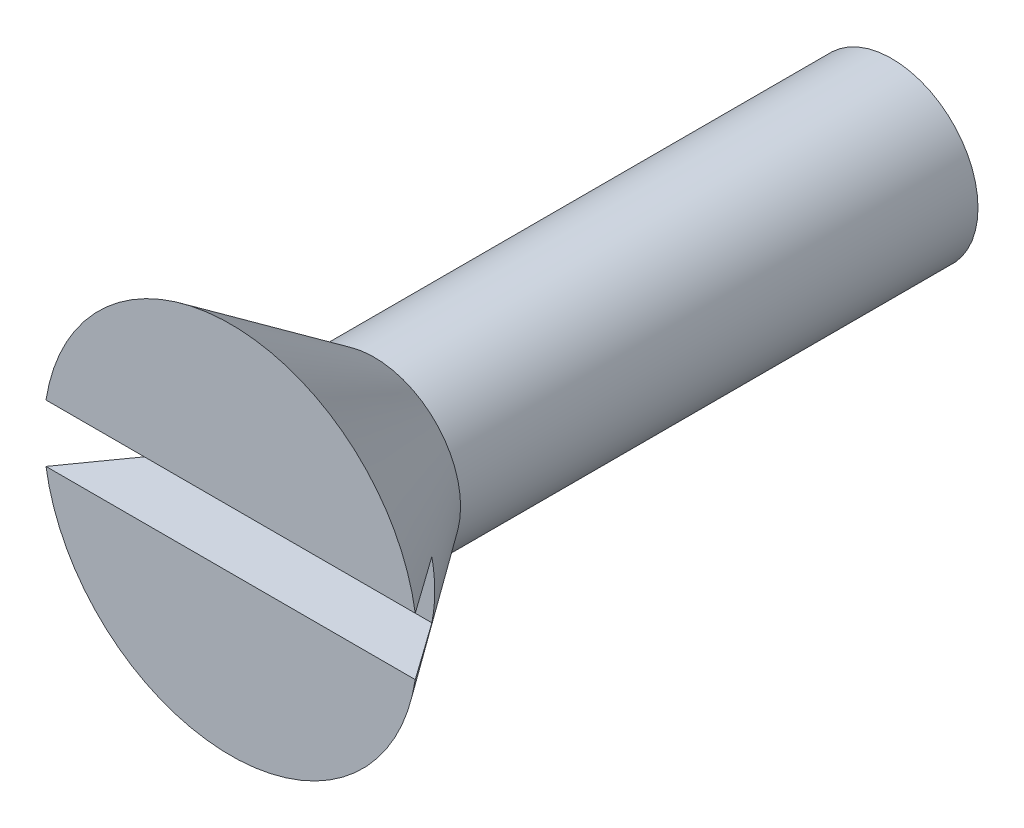
ISO-10303-21;
HEADER;
FILE_DESCRIPTION(('STEP AP214'),'2;1');
FILE_NAME('part.step','',(''),(''),'','','');
FILE_SCHEMA(('AUTOMOTIVE_DESIGN { 1 0 10303 214 1 1 1 1 }'));
ENDSEC;
DATA;
#1=APPLICATION_CONTEXT('core data for automotive mechanical design processes');
#2=APPLICATION_PROTOCOL_DEFINITION('international standard','automotive_design',2000,#1);
#3=PRODUCT_CONTEXT('',#1,'mechanical');
#4=PRODUCT('Part','Part','',(#3));
#5=PRODUCT_RELATED_PRODUCT_CATEGORY('part','',(#4));
#6=PRODUCT_DEFINITION_FORMATION('','',#4);
#7=PRODUCT_DEFINITION_CONTEXT('part definition',#1,'design');
#8=PRODUCT_DEFINITION('design','',#6,#7);
#9=PRODUCT_DEFINITION_SHAPE('','',#8);
#10=(LENGTH_UNIT() NAMED_UNIT(*) SI_UNIT(.MILLI.,.METRE.));
#11=(NAMED_UNIT(*) PLANE_ANGLE_UNIT() SI_UNIT($,.RADIAN.));
#12=(NAMED_UNIT(*) SI_UNIT($,.STERADIAN.) SOLID_ANGLE_UNIT());
#13=UNCERTAINTY_MEASURE_WITH_UNIT(LENGTH_MEASURE(1.E-05),#10,'distance_accuracy_value','');
#14=(GEOMETRIC_REPRESENTATION_CONTEXT(3) GLOBAL_UNCERTAINTY_ASSIGNED_CONTEXT((#13)) GLOBAL_UNIT_ASSIGNED_CONTEXT((#10,
#11,#12)) REPRESENTATION_CONTEXT('',''));
#15=CARTESIAN_POINT('',(0.,0.,0.));
#16=DIRECTION('',(0.,0.,1.));
#17=DIRECTION('',(1.,0.,0.));
#18=AXIS2_PLACEMENT_3D('',#15,#16,#17);
#19=CARTESIAN_POINT('',(-1.38777878078145E-12,6.49999999999973,14.1496458834676));
#20=DIRECTION('',(0.,0.,-1.));
#21=DIRECTION('',(-1.,0.,0.));
#22=AXIS2_PLACEMENT_3D('',#19,#20,#21);
#23=PLANE('',#22);
#24=CARTESIAN_POINT('',(-1.55431223447522E-12,-2.22044604925031E-13,14.1496458834676));
#25=DIRECTION('',(0.,0.,1.));
#26=DIRECTION('',(1.,0.,0.));
#27=AXIS2_PLACEMENT_3D('',#24,#25,#26);
#28=CIRCLE('',#27,6.5);
#29=CARTESIAN_POINT('',(-6.42261628933394,-0.999999999999446,14.1496458834677));
#30=VERTEX_POINT('',#29);
#31=CARTESIAN_POINT('',(6.42261628933177,-1.00000000000033,14.1496458834676));
#32=VERTEX_POINT('',#31);
#33=EDGE_CURVE('E130',#30,#32,#28,.T.);
#34=ORIENTED_EDGE('',*,*,#33,.T.);
#35=DIRECTION('',(-1.,0.,0.));
#36=VECTOR('',#35,1.);
#37=CARTESIAN_POINT('',(-7.7715611723761E-13,-1.00000000000144,14.1496458834676));
#38=LINE('',#37,#36);
#39=EDGE_CURVE('E107',#32,#30,#38,.T.);
#40=ORIENTED_EDGE('',*,*,#39,.T.);
#41=EDGE_LOOP('',(#34,#40));
#42=FACE_BOUND('',#41,.T.);
#43=ADVANCED_FACE('F43',(#42),#23,.F.);
#44=CARTESIAN_POINT('',(0.,0.,-10.5824049241013));
#45=DIRECTION('',(0.,0.,1.));
#46=DIRECTION('',(1.,0.,0.));
#47=AXIS2_PLACEMENT_3D('',#44,#45,#46);
#48=CONICAL_SURFACE('',#47,0.,1.04719755119659);
#49=CARTESIAN_POINT('',(0.,0.,-8.85035411653234));
#50=DIRECTION('',(0.,0.,1.));
#51=DIRECTION('',(1.,0.,0.));
#52=AXIS2_PLACEMENT_3D('',#49,#50,#51);
#53=CIRCLE('',#52,3.);
#54=CARTESIAN_POINT('',(3.,0.,-8.85035411653234));
#55=VERTEX_POINT('',#54);
#56=EDGE_CURVE('E117',#55,#55,#53,.T.);
#57=ORIENTED_EDGE('',*,*,#56,.F.);
#58=EDGE_LOOP('',(#57));
#59=FACE_BOUND('',#58,.T.);
#60=CARTESIAN_POINT('',(0.,0.,-10.5824049241013));
#61=VERTEX_POINT('',#60);
#62=VERTEX_LOOP('',#61);
#63=FACE_BOUND('',#62,.T.);
#64=ADVANCED_FACE('F44',(#59,#63),#48,.T.);
#65=CARTESIAN_POINT('',(0.,0.,20.1828358208955));
#66=DIRECTION('',(0.,0.,1.));
#67=DIRECTION('',(1.,0.,0.));
#68=AXIS2_PLACEMENT_3D('',#65,#66,#67);
#69=CYLINDRICAL_SURFACE('',#68,3.);
#70=CARTESIAN_POINT('',(0.,0.,9.14964588346756));
#71=DIRECTION('',(0.,0.,1.));
#72=DIRECTION('',(1.,0.,0.));
#73=AXIS2_PLACEMENT_3D('',#70,#71,#72);
#74=CIRCLE('',#73,3.);
#75=CARTESIAN_POINT('',(3.,0.,9.14964588346756));
#76=VERTEX_POINT('',#75);
#77=EDGE_CURVE('E125',#76,#76,#74,.T.);
#78=ORIENTED_EDGE('',*,*,#77,.F.);
#79=EDGE_LOOP('',(#78));
#80=FACE_BOUND('',#79,.T.);
#81=ORIENTED_EDGE('',*,*,#56,.T.);
#82=EDGE_LOOP('',(#81));
#83=FACE_BOUND('',#82,.T.);
#84=ADVANCED_FACE('F165',(#80,#83),#69,.T.);
#85=CARTESIAN_POINT('',(0.,0.,9.14964588346756));
#86=DIRECTION('',(0.,0.,1.));
#87=DIRECTION('',(1.,0.,0.));
#88=AXIS2_PLACEMENT_3D('',#85,#86,#87);
#89=CONICAL_SURFACE('',#88,3.,0.610725964389209);
#90=CARTESIAN_POINT('',(-1.11022302462516E-13,0.,12.1496458834676));
#91=DIRECTION('',(0.,0.,-1.));
#92=DIRECTION('',(-1.,0.,0.));
#93=AXIS2_PLACEMENT_3D('',#90,#91,#92);
#94=CIRCLE('',#93,5.1);
#95=CARTESIAN_POINT('',(5.00099990001995,1.00000000000011,12.1496458834676));
#96=VERTEX_POINT('',#95);
#97=CARTESIAN_POINT('',(5.00099990001995,-0.99999999999989,12.1496458834652));
#98=VERTEX_POINT('',#97);
#99=EDGE_CURVE('E11',#96,#98,#94,.T.);
#100=ORIENTED_EDGE('',*,*,#99,.T.);
#101=CARTESIAN_POINT('',(-6.42311219270852,-0.999999999999224,14.1503458834676));
#102=CARTESIAN_POINT('',(-6.24521507547264,-1.00000000000093,13.8992429102574));
#103=CARTESIAN_POINT('',(-6.06721105785819,-1.00000000000163,13.6482155347133));
#104=CARTESIAN_POINT('',(-5.71088793330947,-1.00000000000214,13.1463604487326));
#105=CARTESIAN_POINT('',(-5.53256880699663,-1.00000000000196,12.8955327520568));
#106=CARTESIAN_POINT('',(-5.17499647886631,-1.00000000000182,12.3933987103193));
#107=CARTESIAN_POINT('',(-4.99574208349781,-1.00000000000187,12.1420932146959));
#108=CARTESIAN_POINT('',(-4.63669913452698,-1.00000000000191,11.6398872375847));
#109=CARTESIAN_POINT('',(-4.45691061411305,-1.00000000000189,11.388986732368));
#110=CARTESIAN_POINT('',(-4.05434246098746,-1.00000000000188,10.8289802040448));
#111=CARTESIAN_POINT('',(-3.83136424535352,-1.00000000000189,10.5200166256305));
#112=CARTESIAN_POINT('',(-3.49544297230297,-1.00000000000189,10.0575784065068));
#113=CARTESIAN_POINT('',(-3.38321524822051,-1.00000000000189,9.90358437240352));
#114=CARTESIAN_POINT('',(-3.15811915839049,-1.00000000000189,9.59606827124117));
#115=CARTESIAN_POINT('',(-3.04525080186001,-1.00000000000189,9.44254619744054));
#116=CARTESIAN_POINT('',(-2.81893473483102,-1.00000000000189,9.13654451816765));
#117=CARTESIAN_POINT('',(-2.70548928810521,-1.00000000000189,8.98406324125025));
#118=CARTESIAN_POINT('',(-2.4773595520962,-1.00000000000189,8.6800153299605));
#119=CARTESIAN_POINT('',(-2.36267519059962,-1.00000000000189,8.52844874971496));
#120=CARTESIAN_POINT('',(-2.13153400820244,-1.00000000000189,8.22675410908693));
#121=CARTESIAN_POINT('',(-2.01507786083044,-1.00000000000189,8.07662553576048));
#122=CARTESIAN_POINT('',(-1.83823431248847,-1.00000000000189,7.85315155830844));
#123=CARTESIAN_POINT('',(-1.77892951007902,-1.00000000000189,7.77895027763152));
#124=CARTESIAN_POINT('',(-1.65937552484584,-1.00000000000189,7.63131351599403));
#125=CARTESIAN_POINT('',(-1.59912637111545,-1.00000000000189,7.55787801155723));
#126=CARTESIAN_POINT('',(-1.49735496061013,-1.00000000000189,7.43598614984297));
#127=CARTESIAN_POINT('',(-1.45617701215984,-1.00000000000189,7.38724256686405));
#128=CARTESIAN_POINT('',(-1.37311830533759,-1.00000000000189,7.29034995330537));
#129=CARTESIAN_POINT('',(-1.3312374930686,-1.00000000000189,7.24220096881659));
#130=CARTESIAN_POINT('',(-1.24644783825999,-1.00000000000189,7.14649810999247));
#131=CARTESIAN_POINT('',(-1.20353578171898,-1.00000000000189,7.09894707509988));
#132=CARTESIAN_POINT('',(-1.11660199553895,-1.00000000000188,7.00487999196956));
#133=CARTESIAN_POINT('',(-1.07258044824902,-1.00000000000186,6.95836377599096));
#134=CARTESIAN_POINT('',(-0.984258875570529,-1.00000000000191,6.86792803818071));
#135=CARTESIAN_POINT('',(-0.939995978318124,-1.00000000000198,6.82397243844324));
#136=CARTESIAN_POINT('',(-0.84968596518465,-1.00000000000179,6.73793840098782));
#137=CARTESIAN_POINT('',(-0.80363933249128,-1.00000000000153,6.69585946146322));
#138=CARTESIAN_POINT('',(-0.70940862707268,-1.00000000000225,6.61464730367273));
#139=CARTESIAN_POINT('',(-0.661236704332649,-1.00000000000323,6.57550010715217));
#140=CARTESIAN_POINT('',(-0.561804744038288,-1.00000000000055,6.50138987466255));
#141=CARTESIAN_POINT('',(-0.510550491890798,-0.999999999996904,6.4664193464144));
#142=CARTESIAN_POINT('',(-0.435811432212632,-0.999999999999537,6.42202746100761));
#143=CARTESIAN_POINT('',(-0.413994672181613,-1.00000000000119,6.40980684880937));
#144=CARTESIAN_POINT('',(-0.369660988831818,-1.00000000000258,6.38669833489121));
#145=CARTESIAN_POINT('',(-0.347143820892204,-1.00000000000231,6.37581090549693));
#146=CARTESIAN_POINT('',(-0.278664441258743,-1.00000000000104,6.34564259324346));
#147=CARTESIAN_POINT('',(-0.23158364958198,-0.999999999999585,6.32873724068405));
#148=CARTESIAN_POINT('',(-0.143751659911097,-1.00000000000014,6.30612007528185));
#149=CARTESIAN_POINT('',(-0.10338713341648,-1.00000000000158,6.29894087952852));
#150=CARTESIAN_POINT('',(-0.0219594036917669,-1.0000000000022,6.29167101698697));
#151=CARTESIAN_POINT('',(0.0191042769705767,-1.00000000000139,6.29158540570871));
#152=CARTESIAN_POINT('',(0.100503321516709,-1.0000000000015,6.29852536947134));
#153=CARTESIAN_POINT('',(0.140840098426278,-1.00000000000242,6.30553517710103));
#154=CARTESIAN_POINT('',(0.21993402598272,-1.00000000000135,6.32558374371363));
#155=CARTESIAN_POINT('',(0.258690892735424,-0.999999999999358,6.33862358108198));
#156=CARTESIAN_POINT('',(0.330465253320343,-0.999999999999525,6.36776555343868));
#157=CARTESIAN_POINT('',(0.363667547266921,-1.00000000000129,6.38342669664412));
#158=CARTESIAN_POINT('',(0.428595619010713,-1.00000000000249,6.417585824937));
#159=CARTESIAN_POINT('',(0.460320028526438,-1.00000000000192,6.43608637338645));
#160=CARTESIAN_POINT('',(0.522585950661044,-1.00000000000185,6.47531359690683));
#161=CARTESIAN_POINT('',(0.553120070166,-1.00000000000235,6.49605186019394));
#162=CARTESIAN_POINT('',(0.61299656670685,-1.00000000000142,6.53914024133797));
#163=CARTESIAN_POINT('',(0.6423394790634,-0.999999999999994,6.56148962234949));
#164=CARTESIAN_POINT('',(0.730686952033876,-0.999999999998315,6.63181102768079));
#165=CARTESIAN_POINT('',(0.788092695305722,-1.00000000000093,6.68178416543561));
#166=CARTESIAN_POINT('',(0.899994752824092,-1.00000000000285,6.7849098141464));
#167=CARTESIAN_POINT('',(0.954488405023804,-1.00000000000214,6.83806514304719));
#168=CARTESIAN_POINT('',(1.06149306115347,-1.00000000000163,6.94658407143759));
#169=CARTESIAN_POINT('',(1.11399883295238,-1.00000000000182,7.00195280324566));
#170=CARTESIAN_POINT('',(1.21745270602185,-1.00000000000196,7.11412891318356));
#171=CARTESIAN_POINT('',(1.26840061610216,-1.0000000000019,7.17093646634257));
#172=CARTESIAN_POINT('',(1.36949512242231,-1.00000000000188,7.28601472277127));
#173=CARTESIAN_POINT('',(1.41963282837982,-1.00000000000191,7.34429320993707));
#174=CARTESIAN_POINT('',(1.51898955075105,-1.00000000000187,7.46163435381722));
#175=CARTESIAN_POINT('',(1.56820848811008,-1.00000000000179,7.52069707726911));
#176=CARTESIAN_POINT('',(1.66583472159154,-1.00000000000199,7.63931446603766));
#177=CARTESIAN_POINT('',(1.7142432918869,-1.00000000000226,7.69886808461665));
#178=CARTESIAN_POINT('',(1.81047784179079,-1.00000000000152,7.81843995216072));
#179=CARTESIAN_POINT('',(1.85830384194605,-1.00000000000051,7.87845818461647));
#180=CARTESIAN_POINT('',(2.00819700899594,-0.999999999999249,8.06806772373912));
#181=CARTESIAN_POINT('',(2.10941865781097,-1.00000000000118,8.19832713885501));
#182=CARTESIAN_POINT('',(2.31042525016841,-1.0000000000026,8.45995115296282));
#183=CARTESIAN_POINT('',(2.41021014833084,-1.00000000000208,8.59131578665652));
#184=CARTESIAN_POINT('',(2.60877175431667,-1.0000000000017,8.85482406685835));
#185=CARTESIAN_POINT('',(2.70754836316435,-1.00000000000184,8.98696778787245));
#186=CARTESIAN_POINT('',(2.90435620432949,-1.00000000000194,9.25180951410588));
#187=CARTESIAN_POINT('',(3.00238743225319,-1.00000000000191,9.38450752258541));
#188=CARTESIAN_POINT('',(3.2958661336534,-1.00000000000185,9.78350621100244));
#189=CARTESIAN_POINT('',(3.49048011542761,-1.00000000000188,10.0504196125694));
#190=CARTESIAN_POINT('',(3.87835826017705,-1.0000000000019,10.5851995762721));
#191=CARTESIAN_POINT('',(4.07162249938583,-1.00000000000189,10.8530660832652));
#192=CARTESIAN_POINT('',(4.44551854449152,-1.00000000000189,11.3730977280792));
#193=CARTESIAN_POINT('',(4.62620266343168,-1.00000000000189,11.6252252691424));
#194=CARTESIAN_POINT('',(4.98702305613922,-1.00000000000188,12.1298788244916));
#195=CARTESIAN_POINT('',(5.16715931975634,-1.00000000000187,12.3824048460302));
#196=CARTESIAN_POINT('',(5.52677185493415,-1.00000000000191,12.8873808515398));
#197=CARTESIAN_POINT('',(5.70624870244857,-1.00000000000197,13.1398304254937));
#198=CARTESIAN_POINT('',(6.0648903738312,-1.0000000000018,13.6449432225311));
#199=CARTESIAN_POINT('',(6.24405520412925,-1.00000000000157,13.8976064410485));
#200=CARTESIAN_POINT('',(6.42311219270591,-1.000000000001,14.1503458834675));
#201=B_SPLINE_CURVE_WITH_KNOTS('',3,(#101,#102,#103,#104,#105,#106,#107,#108,#109,#110,#111,
#112,#113,#114,#115,#116,#117,#118,#119,#120,#121,#122,#123,#124,#125,#126,#127,#128,#129,#130,
#131,#132,#133,#134,#135,#136,#137,#138,#139,#140,#141,#142,#143,#144,#145,#146,#147,#148,#149,
#150,#151,#152,#153,#154,#155,#156,#157,#158,#159,#160,#161,#162,#163,#164,#165,#166,#167,#168,
#169,#170,#171,#172,#173,#174,#175,#176,#177,#178,#179,#180,#181,#182,#183,#184,#185,#186,#187,
#188,#189,#190,#191,#192,#193,#194,#195,#196,#197,#198,#199,#200),.UNSPECIFIED.,.F.,.F.,(4,2,2,
2,2,2,2,2,2,2,2,2,2,2,2,2,2,2,2,2,2,2,2,2,2,2,2,2,2,2,2,2,2,2,2,2,2,2,2,2,2,2,2,2,2,2,2,2,2,4),
(0.,0.923201509241621,1.84646192009084,2.77251707642183,3.69851584707458,4.84157654202293,
5.41322473304688,5.98486472023261,6.55502115897105,7.12521101202831,7.69518927526422,
7.980150707677,8.26510337825527,8.45652467666888,8.64796072134196,8.84010072326238,
9.03220934955169,9.21931349760347,9.4063673115371,9.5924634667715,9.7782206149063,
9.85319794763957,9.92820176727341,10.0775406581724,10.1999903842997,10.3225273780832,
10.444792667167,10.5670798301278,10.6770443346256,10.7871087034031,10.8977732132431,
11.0083874278559,11.2364917496209,11.4648011428301,11.6936747166928,11.9225762674838,
12.153196715227,12.3838369158929,12.6140718598626,12.8442986599996,13.3391746463798,
13.8340662293534,14.329005933548,14.8239485529869,15.8149277270121,16.805850470331,
17.7364058749224,18.6669784163905,19.5962168450803,20.5254358925269),.UNSPECIFIED.);
#202=EDGE_CURVE('E128',#98,#32,#201,.T.);
#203=ORIENTED_EDGE('',*,*,#202,.T.);
#204=ORIENTED_EDGE('',*,*,#33,.F.);
#205=CARTESIAN_POINT('',(-5.00099990001995,-1.00000000000011,12.1496458834665));
#206=VERTEX_POINT('',#205);
#207=EDGE_CURVE('E106',#30,#206,#201,.T.);
#208=ORIENTED_EDGE('',*,*,#207,.T.);
#209=CARTESIAN_POINT('',(-5.00099990001995,0.99999999999989,12.1496458834676));
#210=VERTEX_POINT('',#209);
#211=EDGE_CURVE('E50',#206,#210,#94,.T.);
#212=ORIENTED_EDGE('',*,*,#211,.T.);
#213=CARTESIAN_POINT('',(6.42311219270619,0.999999999997669,14.1503458834675));
#214=CARTESIAN_POINT('',(6.24521507547163,0.999999999998523,13.8992429102567));
#215=CARTESIAN_POINT('',(6.06721105785782,0.999999999998874,13.6482155347125));
#216=CARTESIAN_POINT('',(5.7108879333098,0.99999999999913,13.146360448732));
#217=CARTESIAN_POINT('',(5.53256880699702,0.999999999999036,12.8955327520565));
#218=CARTESIAN_POINT('',(5.17499647886728,0.999999999998967,12.39339871032));
#219=CARTESIAN_POINT('',(4.99574208349932,0.999999999998993,12.1420932146973));
#220=CARTESIAN_POINT('',(4.63669913452951,0.999999999999011,11.6398872375874));
#221=CARTESIAN_POINT('',(4.45691061411607,0.999999999999005,11.3889867323713));
#222=CARTESIAN_POINT('',(4.05434246099097,0.999999999998998,10.8289802040487));
#223=CARTESIAN_POINT('',(3.83136424535704,0.999999999998999,10.5200166256344));
#224=CARTESIAN_POINT('',(3.4954429723065,0.999999999999003,10.0575784065105));
#225=CARTESIAN_POINT('',(3.38321524822405,0.999999999999004,9.9035843724072));
#226=CARTESIAN_POINT('',(3.15811915839405,0.999999999999,9.59606827124479));
#227=CARTESIAN_POINT('',(3.0452508018636,0.999999999998993,9.44254619744411));
#228=CARTESIAN_POINT('',(2.81893473483442,0.999999999999011,9.13654451817086));
#229=CARTESIAN_POINT('',(2.70548928810841,0.999999999999035,8.98406324125314));
#230=CARTESIAN_POINT('',(2.47735955209906,0.999999999998969,8.68001532996271));
#231=CARTESIAN_POINT('',(2.36267519060234,0.999999999998878,8.52844874971682));
#232=CARTESIAN_POINT('',(2.13153400820468,0.999999999999126,8.22675410908818));
#233=CARTESIAN_POINT('',(2.01507786083233,0.999999999999464,8.0766255357615));
#234=CARTESIAN_POINT('',(1.83823431249036,0.999999999998771,7.85315155830864));
#235=CARTESIAN_POINT('',(1.778929510081,0.999999999998341,7.77895027763137));
#236=CARTESIAN_POINT('',(1.65937552484703,0.999999999999663,7.63131351599396));
#237=CARTESIAN_POINT('',(1.59912637111577,1.00000000000142,7.55787801155759));
#238=CARTESIAN_POINT('',(1.49735496061057,1.00000000000072,7.43598614984274));
#239=CARTESIAN_POINT('',(1.45617701216078,0.999999999999462,7.38724256686323));
#240=CARTESIAN_POINT('',(1.37311830533882,0.999999999998542,7.29034995330397));
#241=CARTESIAN_POINT('',(1.33123749306964,0.999999999998879,7.2422009688152));
#242=CARTESIAN_POINT('',(1.24644783826098,0.999999999999126,7.14649810999111));
#243=CARTESIAN_POINT('',(1.20353578172013,0.999999999999033,7.09894707509853));
#244=CARTESIAN_POINT('',(1.11660199554033,0.999999999998971,7.00487999196826));
#245=CARTESIAN_POINT('',(1.07258044825046,0.999999999999001,6.95836377598969));
#246=CARTESIAN_POINT('',(0.984258875572305,0.999999999999003,6.86792803817953));
#247=CARTESIAN_POINT('',(0.939995978320168,0.999999999998977,6.82397243844211));
#248=CARTESIAN_POINT('',(0.84968596518704,0.999999999999027,6.73793840098702));
#249=CARTESIAN_POINT('',(0.803639332493744,0.999999999999104,6.6958594614627));
#250=CARTESIAN_POINT('',(0.709408627075732,0.999999999998901,6.61464730367144));
#251=CARTESIAN_POINT('',(0.661236704336198,0.999999999998622,6.57550010714986));
#252=CARTESIAN_POINT('',(0.561804744040221,0.999999999999381,6.5013898746619));
#253=CARTESIAN_POINT('',(0.510550491890609,1.00000000000042,6.46641934641643));
#254=CARTESIAN_POINT('',(0.43581143221329,0.999999999999678,6.42202746100692));
#255=CARTESIAN_POINT('',(0.413994672182933,0.999999999999211,6.40980684880714));
#256=CARTESIAN_POINT('',(0.369660988833646,0.999999999998793,6.38669833488741));
#257=CARTESIAN_POINT('',(0.347143820893881,0.999999999998842,6.37581090549309));
#258=CARTESIAN_POINT('',(0.278664441259517,0.999999999999321,6.34564259324119));
#259=CARTESIAN_POINT('',(0.231583649581665,1.00000000000008,6.32873724068511));
#260=CARTESIAN_POINT('',(0.143751659910515,0.999999999999734,6.30612007528125));
#261=CARTESIAN_POINT('',(0.10338713341647,0.999999999998939,6.2989408795243));
#262=CARTESIAN_POINT('',(0.021959403692412,0.999999999999065,6.29167101698302));
#263=CARTESIAN_POINT('',(-0.0191042769698481,0.999999999999988,6.29158540570868));
#264=CARTESIAN_POINT('',(-0.100503321516765,1.00000000000024,6.29852536947139));
#265=CARTESIAN_POINT('',(-0.140840098427196,0.999999999999565,6.30553517709732));
#266=CARTESIAN_POINT('',(-0.219934025983703,0.999999999998439,6.3255837437097));
#267=CARTESIAN_POINT('',(-0.258690892735611,0.999999999997984,6.33862358108161));
#268=CARTESIAN_POINT('',(-0.330465253321029,0.99999999999823,6.36776555343897));
#269=CARTESIAN_POINT('',(-0.363667547268695,0.99999999999882,6.38342669664213));
#270=CARTESIAN_POINT('',(-0.428595619013069,0.999999999999185,6.4175858249335));
#271=CARTESIAN_POINT('',(-0.460320028528297,0.999999999998959,6.43608637338372));
#272=CARTESIAN_POINT('',(-0.522585950662628,0.999999999999045,6.47531359690434));
#273=CARTESIAN_POINT('',(-0.55312007016781,0.999999999999359,6.49605186019093));
#274=CARTESIAN_POINT('',(-0.612996566707862,0.999999999998645,6.53914024133589));
#275=CARTESIAN_POINT('',(-0.642339479063386,0.999999999997618,6.56148962234886));
#276=CARTESIAN_POINT('',(-0.730686952032849,0.999999999996416,6.63181102768218));
#277=CARTESIAN_POINT('',(-0.788092695306814,0.999999999998309,6.68178416543487));
#278=CARTESIAN_POINT('',(-0.899994752826789,0.999999999999696,6.78490981414434));
#279=CARTESIAN_POINT('',(-0.954488405025992,0.999999999999188,6.83806514304594));
#280=CARTESIAN_POINT('',(-1.06149306115516,0.999999999998816,6.94658407143697));
#281=CARTESIAN_POINT('',(-1.1139988329541,0.999999999998952,7.00195280324486));
#282=CARTESIAN_POINT('',(-1.21745270602343,0.999999999999052,7.11412891318257));
#283=CARTESIAN_POINT('',(-1.26840061610356,0.999999999999016,7.17093646634157));
#284=CARTESIAN_POINT('',(-1.3694951224235,0.999999999998989,7.28601472277024));
#285=CARTESIAN_POINT('',(-1.41963282838096,0.999999999998998,7.34429320993602));
#286=CARTESIAN_POINT('',(-1.51898955075203,0.999999999999006,7.46163435381615));
#287=CARTESIAN_POINT('',(-1.56820848811095,0.999999999999003,7.52069707726803));
#288=CARTESIAN_POINT('',(-1.66583472159245,0.999999999999001,7.63931446603655));
#289=CARTESIAN_POINT('',(-1.71424329188795,0.999999999999002,7.69886808461551));
#290=CARTESIAN_POINT('',(-1.81047784179153,0.999999999999002,7.81843995216002));
#291=CARTESIAN_POINT('',(-1.85830384194633,0.999999999999002,7.87845818461624));
#292=CARTESIAN_POINT('',(-2.00819700899558,0.999999999999001,8.06806772373949));
#293=CARTESIAN_POINT('',(-2.10941865781151,0.999999999999002,8.19832713885466));
#294=CARTESIAN_POINT('',(-2.31042525016957,0.999999999999002,8.45995115296198));
#295=CARTESIAN_POINT('',(-2.41021014833171,0.999999999999002,8.59131578665589));
#296=CARTESIAN_POINT('',(-2.60877175431728,0.999999999999002,8.85482406685788));
#297=CARTESIAN_POINT('',(-2.70754836316498,0.999999999999002,8.98696778787192));
#298=CARTESIAN_POINT('',(-2.90435620433009,0.999999999999002,9.2518095141053));
#299=CARTESIAN_POINT('',(-3.00238743225374,0.999999999999002,9.38450752258484));
#300=CARTESIAN_POINT('',(-3.29586613365364,0.999999999999002,9.78350621100161));
#301=CARTESIAN_POINT('',(-3.49048011542762,0.999999999999001,10.0504196125683));
#302=CARTESIAN_POINT('',(-3.8783582601766,0.999999999999002,10.5851995762705));
#303=CARTESIAN_POINT('',(-4.07162249938516,0.999999999999004,10.8530660832633));
#304=CARTESIAN_POINT('',(-4.44551854449067,0.999999999999,11.3730977280772));
#305=CARTESIAN_POINT('',(-4.62620266343087,0.999999999998996,11.6252252691404));
#306=CARTESIAN_POINT('',(-4.98702305613851,0.999999999999008,12.1298788244897));
#307=CARTESIAN_POINT('',(-5.16715931975569,0.999999999999025,12.3824048460285));
#308=CARTESIAN_POINT('',(-5.52677185493375,0.999999999998979,12.8873808515385));
#309=CARTESIAN_POINT('',(-5.70624870244836,0.999999999998916,13.1398304254928));
#310=CARTESIAN_POINT('',(-6.06489037383151,0.999999999999087,13.6449432225308));
#311=CARTESIAN_POINT('',(-6.24405520412988,0.999999999999321,13.8976064410485));
#312=CARTESIAN_POINT('',(-6.42311219270703,0.99999999999989,14.1503458834676));
#313=B_SPLINE_CURVE_WITH_KNOTS('',3,(#213,#214,#215,#216,#217,#218,#219,#220,#221,#222,#223,
#224,#225,#226,#227,#228,#229,#230,#231,#232,#233,#234,#235,#236,#237,#238,#239,#240,#241,#242,
#243,#244,#245,#246,#247,#248,#249,#250,#251,#252,#253,#254,#255,#256,#257,#258,#259,#260,#261,
#262,#263,#264,#265,#266,#267,#268,#269,#270,#271,#272,#273,#274,#275,#276,#277,#278,#279,#280,
#281,#282,#283,#284,#285,#286,#287,#288,#289,#290,#291,#292,#293,#294,#295,#296,#297,#298,#299,
#300,#301,#302,#303,#304,#305,#306,#307,#308,#309,#310,#311,#312),.UNSPECIFIED.,.F.,.F.,(4,2,2,
2,2,2,2,2,2,2,2,2,2,2,2,2,2,2,2,2,2,2,2,2,2,2,2,2,2,2,2,2,2,2,2,2,2,2,2,2,2,2,2,2,2,2,2,2,2,4),
(0.,0.92320150924078,1.84646192008912,2.7725170764176,3.69851584706785,4.84157654201641,
5.4132247330404,5.9848647202262,6.55502115896578,7.12521101202414,7.69518927526127,
7.9801507076747,8.26510337825365,8.45652467666768,8.64796072134111,8.84010072326118,
9.03220934955029,9.21931349760134,9.4063673115344,9.59246346676921,9.77822061490516,
9.85319794763903,9.92820176727307,10.0775406581728,10.1999903842999,10.3225273780833,
10.4447926671679,10.5670798301294,10.6770443346277,10.7871087034048,10.8977732132445,
11.0083874278574,11.2364917496233,11.4648011428329,11.6936747166953,11.922576267486,
12.153196715229,12.3838369158947,12.6140718598646,12.8442986600018,13.339174646382,
13.8340662293557,14.3290059335502,14.8239485529889,15.8149277270131,16.805850470331,
17.7364058749227,18.666978416391,19.596216845082,20.5254358925298),.UNSPECIFIED.);
#314=CARTESIAN_POINT('',(-6.42261628933372,0.999999999999668,14.1496458834677));
#315=VERTEX_POINT('',#314);
#316=EDGE_CURVE('E82',#210,#315,#313,.T.);
#317=ORIENTED_EDGE('',*,*,#316,.T.);
#318=CARTESIAN_POINT('',(6.42261628933138,0.999999999997891,14.1496458834676));
#319=VERTEX_POINT('',#318);
#320=EDGE_CURVE('E127',#319,#315,#28,.T.);
#321=ORIENTED_EDGE('',*,*,#320,.F.);
#322=EDGE_CURVE('E56',#319,#96,#313,.T.);
#323=ORIENTED_EDGE('',*,*,#322,.T.);
#324=EDGE_LOOP('',(#100,#203,#204,#208,#212,#317,#321,#323));
#325=FACE_BOUND('',#324,.T.);
#326=ORIENTED_EDGE('',*,*,#77,.T.);
#327=EDGE_LOOP('',(#326));
#328=FACE_BOUND('',#327,.T.);
#329=ADVANCED_FACE('F103',(#325,#328),#89,.T.);
#330=ORIENTED_EDGE('',*,*,#320,.T.);
#331=DIRECTION('',(1.,0.,0.));
#332=VECTOR('',#331,1.);
#333=CARTESIAN_POINT('',(-2.77555756156289E-13,1.00000000000011,14.1496458834676));
#334=LINE('',#333,#332);
#335=EDGE_CURVE('E86',#315,#319,#334,.T.);
#336=ORIENTED_EDGE('',*,*,#335,.T.);
#337=EDGE_LOOP('',(#330,#336));
#338=FACE_BOUND('',#337,.T.);
#339=ADVANCED_FACE('F152',(#338),#23,.F.);
#340=CARTESIAN_POINT('',(-6.50000000000039,0.99999999999878,12.1496458834677));
#341=DIRECTION('',(0.,0.,-1.));
#342=DIRECTION('',(-1.,0.,0.));
#343=AXIS2_PLACEMENT_3D('',#340,#341,#342);
#344=PLANE('',#343);
#345=DIRECTION('',(1.,0.,0.));
#346=VECTOR('',#345,1.);
#347=CARTESIAN_POINT('',(-6.50000000000039,0.99999999999878,12.1496458834677));
#348=LINE('',#347,#346);
#349=EDGE_CURVE('E87',#210,#96,#348,.T.);
#350=ORIENTED_EDGE('',*,*,#349,.F.);
#351=ORIENTED_EDGE('',*,*,#211,.F.);
#352=DIRECTION('',(1.,0.,0.));
#353=VECTOR('',#352,1.);
#354=CARTESIAN_POINT('',(-6.50000000000051,-1.00000000000233,12.1496458834677));
#355=LINE('',#354,#353);
#356=EDGE_CURVE('E94',#206,#98,#355,.T.);
#357=ORIENTED_EDGE('',*,*,#356,.T.);
#358=ORIENTED_EDGE('',*,*,#99,.F.);
#359=EDGE_LOOP('',(#350,#351,#357,#358));
#360=FACE_BOUND('',#359,.T.);
#361=ADVANCED_FACE('F100',(#360),#344,.F.);
#362=CARTESIAN_POINT('',(-6.4999999999994,-1.00000000000189,16.1496458834677));
#363=DIRECTION('',(0.,-1.,0.));
#364=DIRECTION('',(0.,0.,-1.));
#365=AXIS2_PLACEMENT_3D('',#362,#363,#364);
#366=PLANE('',#365);
#367=ORIENTED_EDGE('',*,*,#39,.F.);
#368=ORIENTED_EDGE('',*,*,#202,.F.);
#369=ORIENTED_EDGE('',*,*,#356,.F.);
#370=ORIENTED_EDGE('',*,*,#207,.F.);
#371=EDGE_LOOP('',(#367,#368,#369,#370));
#372=FACE_BOUND('',#371,.T.);
#373=ADVANCED_FACE('F148',(#372),#366,.F.);
#374=CARTESIAN_POINT('',(-6.50000000000051,0.999999999999002,16.1496458834677));
#375=DIRECTION('',(0.,1.,0.));
#376=DIRECTION('',(0.,0.,1.));
#377=AXIS2_PLACEMENT_3D('',#374,#375,#376);
#378=PLANE('',#377);
#379=ORIENTED_EDGE('',*,*,#335,.F.);
#380=ORIENTED_EDGE('',*,*,#316,.F.);
#381=ORIENTED_EDGE('',*,*,#349,.T.);
#382=ORIENTED_EDGE('',*,*,#322,.F.);
#383=EDGE_LOOP('',(#379,#380,#381,#382));
#384=FACE_BOUND('',#383,.T.);
#385=ADVANCED_FACE('F88',(#384),#378,.F.);
#386=CLOSED_SHELL('',(#43,#64,#84,#329,#339,#361,#373,#385));
#387=MANIFOLD_SOLID_BREP('B2',#386);
#388=ADVANCED_BREP_SHAPE_REPRESENTATION('',(#18,#387),#14);
#389=SHAPE_DEFINITION_REPRESENTATION(#9,#388);
ENDSEC;
END-ISO-10303-21;
